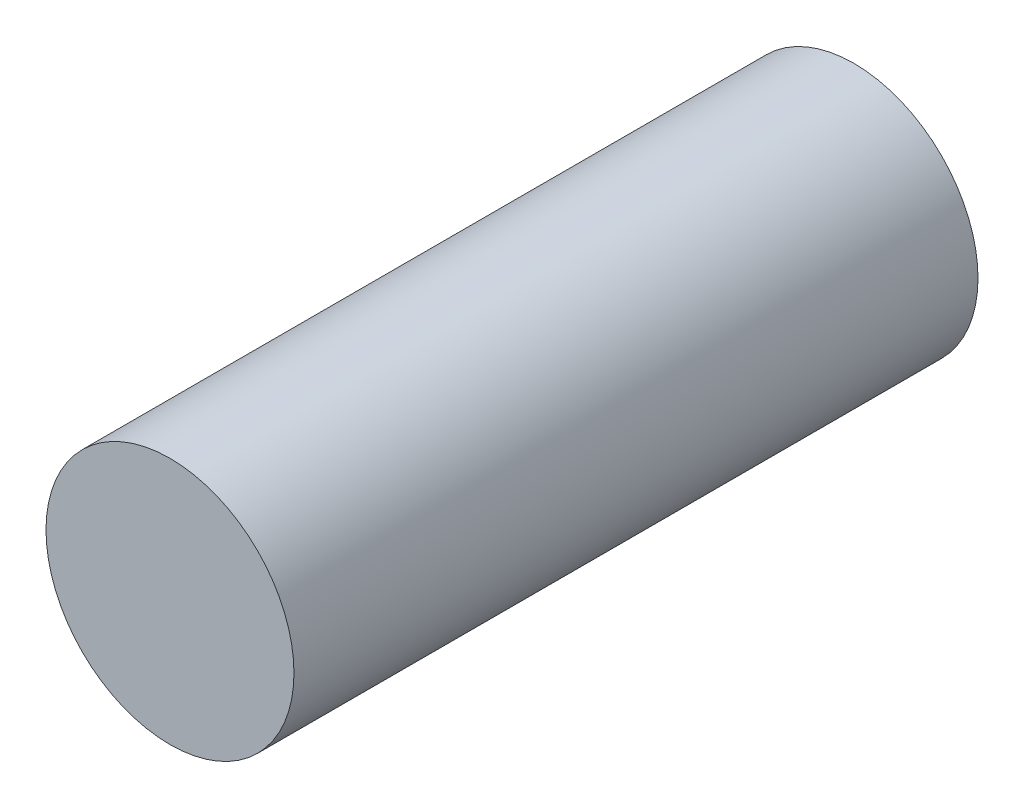
ISO-10303-21;
HEADER;
FILE_DESCRIPTION(('STEP AP214'),'2;1');
FILE_NAME('part.step','',(''),(''),'','','');
FILE_SCHEMA(('AUTOMOTIVE_DESIGN { 1 0 10303 214 1 1 1 1 }'));
ENDSEC;
DATA;
#1=APPLICATION_CONTEXT('core data for automotive mechanical design processes');
#2=APPLICATION_PROTOCOL_DEFINITION('international standard','automotive_design',2000,#1);
#3=PRODUCT_CONTEXT('',#1,'mechanical');
#4=PRODUCT('Part','Part','',(#3));
#5=PRODUCT_RELATED_PRODUCT_CATEGORY('part','',(#4));
#6=PRODUCT_DEFINITION_FORMATION('','',#4);
#7=PRODUCT_DEFINITION_CONTEXT('part definition',#1,'design');
#8=PRODUCT_DEFINITION('design','',#6,#7);
#9=PRODUCT_DEFINITION_SHAPE('','',#8);
#10=(LENGTH_UNIT() NAMED_UNIT(*) SI_UNIT(.MILLI.,.METRE.));
#11=(NAMED_UNIT(*) PLANE_ANGLE_UNIT() SI_UNIT($,.RADIAN.));
#12=(NAMED_UNIT(*) SI_UNIT($,.STERADIAN.) SOLID_ANGLE_UNIT());
#13=UNCERTAINTY_MEASURE_WITH_UNIT(LENGTH_MEASURE(1.E-05),#10,'distance_accuracy_value','');
#14=(GEOMETRIC_REPRESENTATION_CONTEXT(3) GLOBAL_UNCERTAINTY_ASSIGNED_CONTEXT((#13)) GLOBAL_UNIT_ASSIGNED_CONTEXT((#10,
#11,#12)) REPRESENTATION_CONTEXT('',''));
#15=CARTESIAN_POINT('',(0.,0.,0.));
#16=DIRECTION('',(0.,0.,1.));
#17=DIRECTION('',(1.,0.,0.));
#18=AXIS2_PLACEMENT_3D('',#15,#16,#17);
#19=CARTESIAN_POINT('',(0.,0.,8.));
#20=DIRECTION('',(0.,0.,-1.));
#21=DIRECTION('',(-1.,0.,0.));
#22=AXIS2_PLACEMENT_3D('',#19,#20,#21);
#23=CYLINDRICAL_SURFACE('',#22,1.45);
#24=CARTESIAN_POINT('',(0.,0.,8.));
#25=DIRECTION('',(0.,0.,1.));
#26=DIRECTION('',(1.,0.,0.));
#27=AXIS2_PLACEMENT_3D('',#24,#25,#26);
#28=CIRCLE('',#27,1.45);
#29=CARTESIAN_POINT('',(1.45,0.,8.));
#30=VERTEX_POINT('',#29);
#31=EDGE_CURVE('E10',#30,#30,#28,.T.);
#32=ORIENTED_EDGE('',*,*,#31,.F.);
#33=EDGE_LOOP('',(#32));
#34=FACE_BOUND('',#33,.T.);
#35=CARTESIAN_POINT('',(0.,0.,0.));
#36=DIRECTION('',(0.,0.,1.));
#37=DIRECTION('',(1.,0.,0.));
#38=AXIS2_PLACEMENT_3D('',#35,#36,#37);
#39=CIRCLE('',#38,1.45);
#40=CARTESIAN_POINT('',(1.45,0.,0.));
#41=VERTEX_POINT('',#40);
#42=EDGE_CURVE('E34',#41,#41,#39,.T.);
#43=ORIENTED_EDGE('',*,*,#42,.T.);
#44=EDGE_LOOP('',(#43));
#45=FACE_BOUND('',#44,.T.);
#46=ADVANCED_FACE('F31',(#34,#45),#23,.T.);
#47=CARTESIAN_POINT('',(0.,0.,8.));
#48=DIRECTION('',(0.,0.,1.));
#49=DIRECTION('',(1.,0.,0.));
#50=AXIS2_PLACEMENT_3D('',#47,#48,#49);
#51=PLANE('',#50);
#52=ORIENTED_EDGE('',*,*,#31,.T.);
#53=EDGE_LOOP('',(#52));
#54=FACE_BOUND('',#53,.T.);
#55=ADVANCED_FACE('F46',(#54),#51,.T.);
#56=CARTESIAN_POINT('',(0.,0.,0.));
#57=DIRECTION('',(0.,0.,1.));
#58=DIRECTION('',(1.,0.,0.));
#59=AXIS2_PLACEMENT_3D('',#56,#57,#58);
#60=PLANE('',#59);
#61=ORIENTED_EDGE('',*,*,#42,.F.);
#62=EDGE_LOOP('',(#61));
#63=FACE_BOUND('',#62,.T.);
#64=ADVANCED_FACE('F44',(#63),#60,.F.);
#65=CLOSED_SHELL('',(#46,#55,#64));
#66=MANIFOLD_SOLID_BREP('B2',#65);
#67=ADVANCED_BREP_SHAPE_REPRESENTATION('',(#18,#66),#14);
#68=SHAPE_DEFINITION_REPRESENTATION(#9,#67);
ENDSEC;
END-ISO-10303-21;
